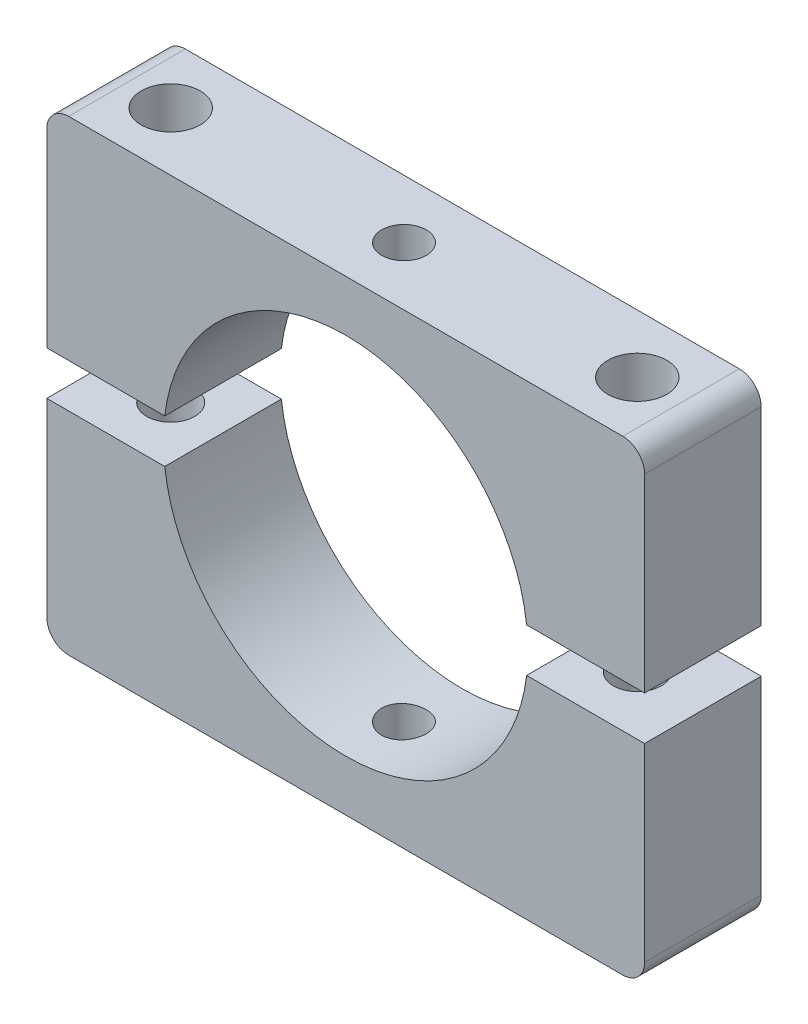
ISO-10303-21;
HEADER;
FILE_DESCRIPTION(('STEP AP214'),'2;1');
FILE_NAME('part.step','',(''),(''),'','','');
FILE_SCHEMA(('AUTOMOTIVE_DESIGN { 1 0 10303 214 1 1 1 1 }'));
ENDSEC;
DATA;
#1=APPLICATION_CONTEXT('core data for automotive mechanical design processes');
#2=APPLICATION_PROTOCOL_DEFINITION('international standard','automotive_design',2000,#1);
#3=PRODUCT_CONTEXT('',#1,'mechanical');
#4=PRODUCT('Part','Part','',(#3));
#5=PRODUCT_RELATED_PRODUCT_CATEGORY('part','',(#4));
#6=PRODUCT_DEFINITION_FORMATION('','',#4);
#7=PRODUCT_DEFINITION_CONTEXT('part definition',#1,'design');
#8=PRODUCT_DEFINITION('design','',#6,#7);
#9=PRODUCT_DEFINITION_SHAPE('','',#8);
#10=(LENGTH_UNIT() NAMED_UNIT(*) SI_UNIT(.MILLI.,.METRE.));
#11=(NAMED_UNIT(*) PLANE_ANGLE_UNIT() SI_UNIT($,.RADIAN.));
#12=(NAMED_UNIT(*) SI_UNIT($,.STERADIAN.) SOLID_ANGLE_UNIT());
#13=UNCERTAINTY_MEASURE_WITH_UNIT(LENGTH_MEASURE(1.E-05),#10,'distance_accuracy_value','');
#14=(GEOMETRIC_REPRESENTATION_CONTEXT(3) GLOBAL_UNCERTAINTY_ASSIGNED_CONTEXT((#13)) GLOBAL_UNIT_ASSIGNED_CONTEXT((#10,
#11,#12)) REPRESENTATION_CONTEXT('',''));
#15=CARTESIAN_POINT('',(0.,0.,0.));
#16=DIRECTION('',(0.,0.,1.));
#17=DIRECTION('',(1.,0.,0.));
#18=AXIS2_PLACEMENT_3D('',#15,#16,#17);
#19=CARTESIAN_POINT('',(0.,0.,4.));
#20=DIRECTION('',(0.,0.,-1.));
#21=DIRECTION('',(-1.,0.,0.));
#22=AXIS2_PLACEMENT_3D('',#19,#20,#21);
#23=PLANE('',#22);
#24=DIRECTION('',(0.,1.,0.));
#25=VECTOR('',#24,1.);
#26=CARTESIAN_POINT('',(20.5,-16.,4.));
#27=LINE('',#26,#25);
#28=CARTESIAN_POINT('',(20.5,-14.5,4.));
#29=VERTEX_POINT('',#28);
#30=CARTESIAN_POINT('',(20.5,-1.5,4.));
#31=VERTEX_POINT('',#30);
#32=EDGE_CURVE('E118',#29,#31,#27,.T.);
#33=ORIENTED_EDGE('',*,*,#32,.T.);
#34=DIRECTION('',(-1.,0.,0.));
#35=VECTOR('',#34,1.);
#36=CARTESIAN_POINT('',(0.,-1.5,4.));
#37=LINE('',#36,#35);
#38=CARTESIAN_POINT('',(12.4096736459909,-1.5,4.));
#39=VERTEX_POINT('',#38);
#40=EDGE_CURVE('E132',#31,#39,#37,.T.);
#41=ORIENTED_EDGE('',*,*,#40,.T.);
#42=CARTESIAN_POINT('',(0.,0.,4.));
#43=DIRECTION('',(0.,0.,1.));
#44=DIRECTION('',(1.,0.,0.));
#45=AXIS2_PLACEMENT_3D('',#42,#43,#44);
#46=CIRCLE('',#45,12.5);
#47=CARTESIAN_POINT('',(-12.4096736459909,-1.5,4.));
#48=VERTEX_POINT('',#47);
#49=EDGE_CURVE('E150',#48,#39,#46,.T.);
#50=ORIENTED_EDGE('',*,*,#49,.F.);
#51=CARTESIAN_POINT('',(-20.5,-1.5,4.));
#52=VERTEX_POINT('',#51);
#53=EDGE_CURVE('E87',#48,#52,#37,.T.);
#54=ORIENTED_EDGE('',*,*,#53,.T.);
#55=DIRECTION('',(0.,-1.,0.));
#56=VECTOR('',#55,1.);
#57=CARTESIAN_POINT('',(-20.5,-16.,4.));
#58=LINE('',#57,#56);
#59=CARTESIAN_POINT('',(-20.5,-14.5,4.));
#60=VERTEX_POINT('',#59);
#61=EDGE_CURVE('E156',#52,#60,#58,.T.);
#62=ORIENTED_EDGE('',*,*,#61,.T.);
#63=CARTESIAN_POINT('',(-19.,-14.5,4.));
#64=DIRECTION('',(0.,0.,-1.));
#65=DIRECTION('',(-1.,0.,0.));
#66=AXIS2_PLACEMENT_3D('',#63,#64,#65);
#67=CIRCLE('',#66,1.5);
#68=CARTESIAN_POINT('',(-19.,-16.,4.));
#69=VERTEX_POINT('',#68);
#70=EDGE_CURVE('E151',#60,#69,#67,.F.);
#71=ORIENTED_EDGE('',*,*,#70,.T.);
#72=DIRECTION('',(1.,0.,0.));
#73=VECTOR('',#72,1.);
#74=CARTESIAN_POINT('',(-20.5,-16.,4.));
#75=LINE('',#74,#73);
#76=CARTESIAN_POINT('',(19.,-16.,4.));
#77=VERTEX_POINT('',#76);
#78=EDGE_CURVE('E120',#69,#77,#75,.T.);
#79=ORIENTED_EDGE('',*,*,#78,.T.);
#80=CARTESIAN_POINT('',(19.,-14.5,4.));
#81=DIRECTION('',(0.,0.,-1.));
#82=DIRECTION('',(-1.,0.,0.));
#83=AXIS2_PLACEMENT_3D('',#80,#81,#82);
#84=CIRCLE('',#83,1.5);
#85=EDGE_CURVE('E115',#77,#29,#84,.F.);
#86=ORIENTED_EDGE('',*,*,#85,.T.);
#87=EDGE_LOOP('',(#33,#41,#50,#54,#62,#71,#79,#86));
#88=FACE_BOUND('',#87,.T.);
#89=ADVANCED_FACE('F48',(#88),#23,.F.);
#90=CARTESIAN_POINT('',(0.,0.,-4.));
#91=DIRECTION('',(0.,0.,-1.));
#92=DIRECTION('',(-1.,0.,0.));
#93=AXIS2_PLACEMENT_3D('',#90,#91,#92);
#94=PLANE('',#93);
#95=DIRECTION('',(-1.,0.,0.));
#96=VECTOR('',#95,1.);
#97=CARTESIAN_POINT('',(0.,-1.5,-4.));
#98=LINE('',#97,#96);
#99=CARTESIAN_POINT('',(20.5,-1.5,-4.));
#100=VERTEX_POINT('',#99);
#101=CARTESIAN_POINT('',(12.4096736459909,-1.5,-4.));
#102=VERTEX_POINT('',#101);
#103=EDGE_CURVE('E59',#100,#102,#98,.T.);
#104=ORIENTED_EDGE('',*,*,#103,.F.);
#105=DIRECTION('',(0.,1.,0.));
#106=VECTOR('',#105,1.);
#107=CARTESIAN_POINT('',(20.5,-16.,-4.));
#108=LINE('',#107,#106);
#109=CARTESIAN_POINT('',(20.5,-14.5,-4.));
#110=VERTEX_POINT('',#109);
#111=EDGE_CURVE('E140',#110,#100,#108,.T.);
#112=ORIENTED_EDGE('',*,*,#111,.F.);
#113=CARTESIAN_POINT('',(19.,-14.5,-4.));
#114=DIRECTION('',(0.,0.,-1.));
#115=DIRECTION('',(-1.,0.,0.));
#116=AXIS2_PLACEMENT_3D('',#113,#114,#115);
#117=CIRCLE('',#116,1.5);
#118=CARTESIAN_POINT('',(19.,-16.,-4.));
#119=VERTEX_POINT('',#118);
#120=EDGE_CURVE('E124',#110,#119,#117,.T.);
#121=ORIENTED_EDGE('',*,*,#120,.T.);
#122=DIRECTION('',(1.,0.,0.));
#123=VECTOR('',#122,1.);
#124=CARTESIAN_POINT('',(-20.5,-16.,-4.));
#125=LINE('',#124,#123);
#126=CARTESIAN_POINT('',(-19.,-16.,-4.));
#127=VERTEX_POINT('',#126);
#128=EDGE_CURVE('E146',#127,#119,#125,.T.);
#129=ORIENTED_EDGE('',*,*,#128,.F.);
#130=CARTESIAN_POINT('',(-19.,-14.5,-4.));
#131=DIRECTION('',(0.,0.,-1.));
#132=DIRECTION('',(-1.,0.,0.));
#133=AXIS2_PLACEMENT_3D('',#130,#131,#132);
#134=CIRCLE('',#133,1.5);
#135=CARTESIAN_POINT('',(-20.5,-14.5,-4.));
#136=VERTEX_POINT('',#135);
#137=EDGE_CURVE('E144',#127,#136,#134,.T.);
#138=ORIENTED_EDGE('',*,*,#137,.T.);
#139=DIRECTION('',(0.,-1.,0.));
#140=VECTOR('',#139,1.);
#141=CARTESIAN_POINT('',(-20.5,-16.,-4.));
#142=LINE('',#141,#140);
#143=CARTESIAN_POINT('',(-20.5,-1.5,-4.));
#144=VERTEX_POINT('',#143);
#145=EDGE_CURVE('E138',#144,#136,#142,.T.);
#146=ORIENTED_EDGE('',*,*,#145,.F.);
#147=CARTESIAN_POINT('',(-12.4096736459909,-1.5,-4.));
#148=VERTEX_POINT('',#147);
#149=EDGE_CURVE('E12',#148,#144,#98,.T.);
#150=ORIENTED_EDGE('',*,*,#149,.F.);
#151=CARTESIAN_POINT('',(0.,0.,-4.));
#152=DIRECTION('',(0.,0.,1.));
#153=DIRECTION('',(1.,0.,0.));
#154=AXIS2_PLACEMENT_3D('',#151,#152,#153);
#155=CIRCLE('',#154,12.5);
#156=EDGE_CURVE('E51',#148,#102,#155,.T.);
#157=ORIENTED_EDGE('',*,*,#156,.T.);
#158=EDGE_LOOP('',(#104,#112,#121,#129,#138,#146,#150,#157));
#159=FACE_BOUND('',#158,.T.);
#160=ADVANCED_FACE('F183',(#159),#94,.T.);
#161=CARTESIAN_POINT('',(20.5,-16.,4.));
#162=DIRECTION('',(-1.,0.,0.));
#163=DIRECTION('',(0.,-1.,0.));
#164=AXIS2_PLACEMENT_3D('',#161,#162,#163);
#165=PLANE('',#164);
#166=ORIENTED_EDGE('',*,*,#111,.T.);
#167=DIRECTION('',(0.,0.,1.));
#168=VECTOR('',#167,1.);
#169=CARTESIAN_POINT('',(20.5,-1.5,4.));
#170=LINE('',#169,#168);
#171=EDGE_CURVE('E84',#100,#31,#170,.T.);
#172=ORIENTED_EDGE('',*,*,#171,.T.);
#173=ORIENTED_EDGE('',*,*,#32,.F.);
#174=DIRECTION('',(0.,0.,-1.));
#175=VECTOR('',#174,1.);
#176=CARTESIAN_POINT('',(20.5,-14.5,4.));
#177=LINE('',#176,#175);
#178=EDGE_CURVE('E130',#29,#110,#177,.T.);
#179=ORIENTED_EDGE('',*,*,#178,.T.);
#180=EDGE_LOOP('',(#166,#172,#173,#179));
#181=FACE_BOUND('',#180,.T.);
#182=ADVANCED_FACE('F129',(#181),#165,.F.);
#183=CARTESIAN_POINT('',(-20.5,-16.,4.));
#184=DIRECTION('',(1.,0.,0.));
#185=DIRECTION('',(0.,0.,-1.));
#186=AXIS2_PLACEMENT_3D('',#183,#184,#185);
#187=PLANE('',#186);
#188=ORIENTED_EDGE('',*,*,#61,.F.);
#189=DIRECTION('',(0.,0.,-1.));
#190=VECTOR('',#189,1.);
#191=CARTESIAN_POINT('',(-20.5,-1.5,4.));
#192=LINE('',#191,#190);
#193=EDGE_CURVE('E66',#52,#144,#192,.T.);
#194=ORIENTED_EDGE('',*,*,#193,.T.);
#195=ORIENTED_EDGE('',*,*,#145,.T.);
#196=DIRECTION('',(0.,0.,-1.));
#197=VECTOR('',#196,1.);
#198=CARTESIAN_POINT('',(-20.5,-14.5,4.));
#199=LINE('',#198,#197);
#200=EDGE_CURVE('E159',#136,#60,#199,.F.);
#201=ORIENTED_EDGE('',*,*,#200,.T.);
#202=EDGE_LOOP('',(#188,#194,#195,#201));
#203=FACE_BOUND('',#202,.T.);
#204=ADVANCED_FACE('F248',(#203),#187,.F.);
#205=CARTESIAN_POINT('',(0.,0.,4.));
#206=DIRECTION('',(0.,0.,-1.));
#207=DIRECTION('',(-1.,0.,0.));
#208=AXIS2_PLACEMENT_3D('',#205,#206,#207);
#209=CYLINDRICAL_SURFACE('',#208,12.5);
#210=CARTESIAN_POINT('',(0.,-12.5,1.525));
#211=CARTESIAN_POINT('',(0.0853198948416378,-12.4999988332016,1.52499636523877));
#212=CARTESIAN_POINT('',(0.170693512679377,-12.4991172288424,1.51781571432522));
#213=CARTESIAN_POINT('',(0.339066246117368,-12.4956851314441,1.48928338811871));
#214=CARTESIAN_POINT('',(0.422062768492173,-12.49313288321,1.46791680861084));
#215=CARTESIAN_POINT('',(0.58321930610524,-12.4866470988356,1.41165051255262));
#216=CARTESIAN_POINT('',(0.661382493198119,-12.4827144801189,1.37675978283694));
#217=CARTESIAN_POINT('',(0.810728807188661,-12.4739056499513,1.29445498182486));
#218=CARTESIAN_POINT('',(0.881913153383581,-12.4690296037741,1.24704310350715));
#219=CARTESIAN_POINT('',(1.01567033861062,-12.4588499101414,1.14077536663807));
#220=CARTESIAN_POINT('',(1.07820123027228,-12.4535443647524,1.08186688625394));
#221=CARTESIAN_POINT('',(1.19251530896286,-12.4431189941467,0.954391053812945));
#222=CARTESIAN_POINT('',(1.24429795517592,-12.4379991782859,0.885823216020703));
#223=CARTESIAN_POINT('',(1.33580096543978,-12.4285061980782,0.740703645576914));
#224=CARTESIAN_POINT('',(1.37548218894778,-12.4241354761338,0.664127059908715));
#225=CARTESIAN_POINT('',(1.44140599645811,-12.4166604241591,0.505334761173804));
#226=CARTESIAN_POINT('',(1.46764906643114,-12.4135560483341,0.423119252152248));
#227=CARTESIAN_POINT('',(1.50582452011986,-12.4089832013221,0.25581742696445));
#228=CARTESIAN_POINT('',(1.51782759265451,-12.4075066520442,0.170747465422098));
#229=CARTESIAN_POINT('',(1.52740103458355,-12.4063318785741,-0.000211229125065101));
#230=CARTESIAN_POINT('',(1.52497195778642,-12.4066335861443,-0.0860999305858919));
#231=CARTESIAN_POINT('',(1.50580811072198,-12.4089738456448,-0.25576610546058));
#232=CARTESIAN_POINT('',(1.48915111652638,-12.4110029546355,-0.339552512440146));
#233=CARTESIAN_POINT('',(1.44212557160128,-12.4165546575979,-0.50313187548701));
#234=CARTESIAN_POINT('',(1.41175675512441,-12.420077280515,-0.582924754122869));
#235=CARTESIAN_POINT('',(1.33808573219168,-12.42822983019,-0.73649418866941));
#236=CARTESIAN_POINT('',(1.29474963467546,-12.4328626521474,-0.810254326243766));
#237=CARTESIAN_POINT('',(1.19639846075497,-12.4427113346329,-0.949484622206174));
#238=CARTESIAN_POINT('',(1.14138287538483,-12.4479272205648,-1.01495441912122));
#239=CARTESIAN_POINT('',(1.0208029364806,-12.4583963250439,-1.13619709214587));
#240=CARTESIAN_POINT('',(0.955171526751117,-12.4636495633235,-1.19190329859424));
#241=CARTESIAN_POINT('',(0.815454113813721,-12.4735693041452,-1.29151870359851));
#242=CARTESIAN_POINT('',(0.741368092651599,-12.4782358054412,-1.33542787710156));
#243=CARTESIAN_POINT('',(0.586793758984002,-12.4864589872456,-1.4102024870041));
#244=CARTESIAN_POINT('',(0.506303457935524,-12.4900153213437,-1.44106385310286));
#245=CARTESIAN_POINT('',(0.34123021275759,-12.4956142820611,-1.48881441691267));
#246=CARTESIAN_POINT('',(0.256647451269799,-12.4976569761661,-1.50570423754957));
#247=CARTESIAN_POINT('',(0.0863668551536736,-12.499989743007,-1.52494610224861));
#248=CARTESIAN_POINT('',(0.000679546644678211,-12.5002908899645,-1.52739000779428));
#249=CARTESIAN_POINT('',(-0.169883415677942,-12.4991365044925,-1.51791294112788));
#250=CARTESIAN_POINT('',(-0.254759085903897,-12.4976810076605,-1.50599226000728));
#251=CARTESIAN_POINT('',(-0.42101918714677,-12.4931837986024,-1.46820070506497));
#252=CARTESIAN_POINT('',(-0.502413696551286,-12.4901470559664,-1.44237352840944));
#253=CARTESIAN_POINT('',(-0.659716025905075,-12.4828274266629,-1.37754748258066));
#254=CARTESIAN_POINT('',(-0.735623667539808,-12.4785444995192,-1.33854818556772));
#255=CARTESIAN_POINT('',(-0.880208450125718,-12.4691825866601,-1.24826196267637));
#256=CARTESIAN_POINT('',(-0.948848157141478,-12.4640997858921,-1.19691549224077));
#257=CARTESIAN_POINT('',(-1.0765680404379,-12.4537189234349,-1.08347684826168));
#258=CARTESIAN_POINT('',(-1.13564785572844,-12.4484208536265,-1.02138426911859));
#259=CARTESIAN_POINT('',(-1.24289590788522,-12.4381725199058,-0.887811837372622));
#260=CARTESIAN_POINT('',(-1.29100332981586,-12.4332242945869,-0.816282976102471));
#261=CARTESIAN_POINT('',(-1.37452114070359,-12.4242691290256,-0.666106748996589));
#262=CARTESIAN_POINT('',(-1.40993177395118,-12.4202621706735,-0.587459520157118));
#263=CARTESIAN_POINT('',(-1.46695192954314,-12.4136569749732,-0.425476906693061));
#264=CARTESIAN_POINT('',(-1.48859598827068,-12.4110552148821,-0.342153829114185));
#265=CARTESIAN_POINT('',(-1.51757993481081,-12.4075447926587,-0.173022179205642));
#266=CARTESIAN_POINT('',(-1.52492045401336,-12.4066360557925,-0.0872137167560801));
#267=CARTESIAN_POINT('',(-1.5250777405557,-12.4066166737696,0.0838479753091421));
#268=CARTESIAN_POINT('',(-1.51799004717424,-12.4074942005111,0.169101131554043));
#269=CARTESIAN_POINT('',(-1.48969415478954,-12.4109230687954,0.337194968824707));
#270=CARTESIAN_POINT('',(-1.468485952095,-12.4134744107759,0.420035649219806));
#271=CARTESIAN_POINT('',(-1.41258049024345,-12.4199598293504,0.580941950571393));
#272=CARTESIAN_POINT('',(-1.37788760268078,-12.423893457782,0.659009109571016));
#273=CARTESIAN_POINT('',(-1.29600700161678,-12.4327009922974,0.808228991460829));
#274=CARTESIAN_POINT('',(-1.24881916096665,-12.4375749079495,0.879381643978845));
#275=CARTESIAN_POINT('',(-1.14293300648916,-12.4477525277591,1.01324136748718));
#276=CARTESIAN_POINT('',(-1.08416346573133,-12.4530587658317,1.07589190728544));
#277=CARTESIAN_POINT('',(-0.956930128289263,-12.4634806595471,1.19047896713539));
#278=CARTESIAN_POINT('',(-0.888464044881476,-12.4685962698738,1.24241295279682));
#279=CARTESIAN_POINT('',(-0.743497505156658,-12.4780808944062,1.33425187091181));
#280=CARTESIAN_POINT('',(-0.666968800934893,-12.4824471325884,1.37411247776527));
#281=CARTESIAN_POINT('',(-0.508294192840607,-12.4899127269404,1.44036028305423));
#282=CARTESIAN_POINT('',(-0.426154534728733,-12.4930134657992,1.46676219440697));
#283=CARTESIAN_POINT('',(-0.286320391114617,-12.4968470412095,1.49898850801593));
#284=CARTESIAN_POINT('',(-0.229509405562381,-12.4980236732172,1.50872889062371));
#285=CARTESIAN_POINT('',(-0.115140433345456,-12.4996005436692,1.52173584082289));
#286=CARTESIAN_POINT('',(-0.0575824518400368,-12.500000787473,1.52500245310269));
#287=CARTESIAN_POINT('',(0.,-12.5,1.525));
#288=B_SPLINE_CURVE_WITH_KNOTS('',3,(#210,#211,#212,#213,#214,#215,#216,#217,#218,#219,#220,
#221,#222,#223,#224,#225,#226,#227,#228,#229,#230,#231,#232,#233,#234,#235,#236,#237,#238,#239,
#240,#241,#242,#243,#244,#245,#246,#247,#248,#249,#250,#251,#252,#253,#254,#255,#256,#257,#258,
#259,#260,#261,#262,#263,#264,#265,#266,#267,#268,#269,#270,#271,#272,#273,#274,#275,#276,#277,
#278,#279,#280,#281,#282,#283,#284,#285,#286,#287),.UNSPECIFIED.,.T.,.F.,(4,2,2,2,2,2,2,2,2,2,2,
2,2,2,2,2,2,2,2,2,2,2,2,2,2,2,2,2,2,2,2,2,2,2,2,2,2,2,4),(0.,0.255749362188368,
0.511767849382742,0.767616502443296,1.02342037534858,1.28042379264341,1.53744013835956,
1.79527916419697,2.05310886501381,2.30965324450481,2.56618777961767,2.82132889304306,
3.07647495154312,3.33229376805136,3.58812373485874,3.84563777315018,4.10315235830852,
4.36074721670891,4.61833058954062,4.87427421406517,5.13021265210203,5.38535153068871,
5.64049869716173,5.89690190478957,6.15331479217506,6.41111607514145,6.66891239765803,
6.92605940545703,7.18319506195945,7.43863358267919,7.69407217017451,7.94942801611774,
8.204786460665,8.46176732436251,8.71880889276407,8.97678302082177,9.23447452596841,
9.40708112631514,9.5796865351552),.UNSPECIFIED.);
#289=CARTESIAN_POINT('',(0.,-12.5,1.525));
#290=VERTEX_POINT('',#289);
#291=EDGE_CURVE('E198',#290,#290,#288,.T.);
#292=ORIENTED_EDGE('',*,*,#291,.F.);
#293=EDGE_LOOP('',(#292));
#294=FACE_BOUND('',#293,.T.);
#295=DIRECTION('',(0.,0.,-1.));
#296=VECTOR('',#295,1.);
#297=CARTESIAN_POINT('',(-12.4096736459909,-1.5,4.));
#298=LINE('',#297,#296);
#299=EDGE_CURVE('E57',#48,#148,#298,.T.);
#300=ORIENTED_EDGE('',*,*,#299,.F.);
#301=ORIENTED_EDGE('',*,*,#49,.T.);
#302=DIRECTION('',(0.,0.,-1.));
#303=VECTOR('',#302,1.);
#304=CARTESIAN_POINT('',(12.4096736459909,-1.5,4.));
#305=LINE('',#304,#303);
#306=EDGE_CURVE('E154',#102,#39,#305,.F.);
#307=ORIENTED_EDGE('',*,*,#306,.F.);
#308=ORIENTED_EDGE('',*,*,#156,.F.);
#309=EDGE_LOOP('',(#300,#301,#307,#308));
#310=FACE_BOUND('',#309,.T.);
#311=ADVANCED_FACE('F184',(#294,#310),#209,.F.);
#312=CARTESIAN_POINT('',(-20.5,-16.,4.));
#313=DIRECTION('',(0.,1.,0.));
#314=DIRECTION('',(-1.,0.,0.));
#315=AXIS2_PLACEMENT_3D('',#312,#313,#314);
#316=PLANE('',#315);
#317=CARTESIAN_POINT('',(0.,-16.,0.));
#318=DIRECTION('',(0.,1.,0.));
#319=DIRECTION('',(-1.,0.,0.));
#320=AXIS2_PLACEMENT_3D('',#317,#318,#319);
#321=CIRCLE('',#320,1.525);
#322=CARTESIAN_POINT('',(-1.525,-16.,0.));
#323=VERTEX_POINT('',#322);
#324=EDGE_CURVE('E206',#323,#323,#321,.F.);
#325=ORIENTED_EDGE('',*,*,#324,.F.);
#326=EDGE_LOOP('',(#325));
#327=FACE_BOUND('',#326,.T.);
#328=CARTESIAN_POINT('',(-16.,-16.,0.));
#329=DIRECTION('',(0.,1.,0.));
#330=DIRECTION('',(0.,0.,1.));
#331=AXIS2_PLACEMENT_3D('',#328,#329,#330);
#332=CIRCLE('',#331,1.65);
#333=CARTESIAN_POINT('',(-16.,-16.,1.65));
#334=VERTEX_POINT('',#333);
#335=EDGE_CURVE('E192',#334,#334,#332,.T.);
#336=ORIENTED_EDGE('',*,*,#335,.T.);
#337=EDGE_LOOP('',(#336));
#338=FACE_BOUND('',#337,.T.);
#339=CARTESIAN_POINT('',(16.,-16.,0.));
#340=DIRECTION('',(0.,1.,0.));
#341=DIRECTION('',(0.,0.,1.));
#342=AXIS2_PLACEMENT_3D('',#339,#340,#341);
#343=CIRCLE('',#342,1.65);
#344=CARTESIAN_POINT('',(16.,-16.,1.65));
#345=VERTEX_POINT('',#344);
#346=EDGE_CURVE('E133',#345,#345,#343,.T.);
#347=ORIENTED_EDGE('',*,*,#346,.T.);
#348=EDGE_LOOP('',(#347));
#349=FACE_BOUND('',#348,.T.);
#350=ORIENTED_EDGE('',*,*,#128,.T.);
#351=DIRECTION('',(0.,0.,-1.));
#352=VECTOR('',#351,1.);
#353=CARTESIAN_POINT('',(19.,-16.,4.));
#354=LINE('',#353,#352);
#355=EDGE_CURVE('E149',#119,#77,#354,.F.);
#356=ORIENTED_EDGE('',*,*,#355,.T.);
#357=ORIENTED_EDGE('',*,*,#78,.F.);
#358=DIRECTION('',(0.,0.,-1.));
#359=VECTOR('',#358,1.);
#360=CARTESIAN_POINT('',(-19.,-16.,4.));
#361=LINE('',#360,#359);
#362=EDGE_CURVE('E155',#69,#127,#361,.T.);
#363=ORIENTED_EDGE('',*,*,#362,.T.);
#364=EDGE_LOOP('',(#350,#356,#357,#363));
#365=FACE_BOUND('',#364,.T.);
#366=ADVANCED_FACE('F231',(#327,#338,#349,#365),#316,.F.);
#367=CARTESIAN_POINT('',(19.,-14.5,4.));
#368=DIRECTION('',(0.,0.,-1.));
#369=DIRECTION('',(-1.,0.,0.));
#370=AXIS2_PLACEMENT_3D('',#367,#368,#369);
#371=CYLINDRICAL_SURFACE('',#370,1.5);
#372=ORIENTED_EDGE('',*,*,#85,.F.);
#373=ORIENTED_EDGE('',*,*,#355,.F.);
#374=ORIENTED_EDGE('',*,*,#120,.F.);
#375=ORIENTED_EDGE('',*,*,#178,.F.);
#376=EDGE_LOOP('',(#372,#373,#374,#375));
#377=FACE_BOUND('',#376,.T.);
#378=ADVANCED_FACE('F136',(#377),#371,.T.);
#379=CARTESIAN_POINT('',(-19.,-14.5,4.));
#380=DIRECTION('',(0.,0.,-1.));
#381=DIRECTION('',(-1.,0.,0.));
#382=AXIS2_PLACEMENT_3D('',#379,#380,#381);
#383=CYLINDRICAL_SURFACE('',#382,1.5);
#384=ORIENTED_EDGE('',*,*,#70,.F.);
#385=ORIENTED_EDGE('',*,*,#200,.F.);
#386=ORIENTED_EDGE('',*,*,#137,.F.);
#387=ORIENTED_EDGE('',*,*,#362,.F.);
#388=EDGE_LOOP('',(#384,#385,#386,#387));
#389=FACE_BOUND('',#388,.T.);
#390=ADVANCED_FACE('F224',(#389),#383,.T.);
#391=CARTESIAN_POINT('',(-25.5,-1.5,-20.));
#392=DIRECTION('',(0.,-1.,0.));
#393=DIRECTION('',(0.,0.,-1.));
#394=AXIS2_PLACEMENT_3D('',#391,#392,#393);
#395=PLANE('',#394);
#396=CARTESIAN_POINT('',(16.,-1.5,0.));
#397=DIRECTION('',(0.,1.,0.));
#398=DIRECTION('',(0.,0.,1.));
#399=AXIS2_PLACEMENT_3D('',#396,#397,#398);
#400=CIRCLE('',#399,1.64999999999999);
#401=CARTESIAN_POINT('',(16.,-1.5,1.64999999999999));
#402=VERTEX_POINT('',#401);
#403=EDGE_CURVE('E189',#402,#402,#400,.T.);
#404=ORIENTED_EDGE('',*,*,#403,.F.);
#405=EDGE_LOOP('',(#404));
#406=FACE_BOUND('',#405,.T.);
#407=ORIENTED_EDGE('',*,*,#103,.T.);
#408=ORIENTED_EDGE('',*,*,#306,.T.);
#409=ORIENTED_EDGE('',*,*,#40,.F.);
#410=ORIENTED_EDGE('',*,*,#171,.F.);
#411=EDGE_LOOP('',(#407,#408,#409,#410));
#412=FACE_BOUND('',#411,.T.);
#413=ADVANCED_FACE('F227',(#406,#412),#395,.F.);
#414=CARTESIAN_POINT('',(-16.,-1.5,0.));
#415=DIRECTION('',(0.,1.,0.));
#416=DIRECTION('',(0.,0.,1.));
#417=AXIS2_PLACEMENT_3D('',#414,#415,#416);
#418=CIRCLE('',#417,1.64999999999999);
#419=CARTESIAN_POINT('',(-16.,-1.5,1.64999999999999));
#420=VERTEX_POINT('',#419);
#421=EDGE_CURVE('E195',#420,#420,#418,.T.);
#422=ORIENTED_EDGE('',*,*,#421,.F.);
#423=EDGE_LOOP('',(#422));
#424=FACE_BOUND('',#423,.T.);
#425=ORIENTED_EDGE('',*,*,#53,.F.);
#426=ORIENTED_EDGE('',*,*,#299,.T.);
#427=ORIENTED_EDGE('',*,*,#149,.T.);
#428=ORIENTED_EDGE('',*,*,#193,.F.);
#429=EDGE_LOOP('',(#425,#426,#427,#428));
#430=FACE_BOUND('',#429,.T.);
#431=ADVANCED_FACE('F222',(#424,#430),#395,.F.);
#432=CARTESIAN_POINT('',(16.,-1.5,0.));
#433=DIRECTION('',(0.,1.,0.));
#434=DIRECTION('',(0.,0.,1.));
#435=AXIS2_PLACEMENT_3D('',#432,#433,#434);
#436=CYLINDRICAL_SURFACE('',#435,1.64999999999999);
#437=ORIENTED_EDGE('',*,*,#346,.F.);
#438=EDGE_LOOP('',(#437));
#439=FACE_BOUND('',#438,.T.);
#440=ORIENTED_EDGE('',*,*,#403,.T.);
#441=EDGE_LOOP('',(#440));
#442=FACE_BOUND('',#441,.T.);
#443=ADVANCED_FACE('F218',(#439,#442),#436,.F.);
#444=CARTESIAN_POINT('',(-16.,-1.5,0.));
#445=DIRECTION('',(0.,1.,0.));
#446=DIRECTION('',(0.,0.,1.));
#447=AXIS2_PLACEMENT_3D('',#444,#445,#446);
#448=CYLINDRICAL_SURFACE('',#447,1.64999999999999);
#449=ORIENTED_EDGE('',*,*,#335,.F.);
#450=EDGE_LOOP('',(#449));
#451=FACE_BOUND('',#450,.T.);
#452=ORIENTED_EDGE('',*,*,#421,.T.);
#453=EDGE_LOOP('',(#452));
#454=FACE_BOUND('',#453,.T.);
#455=ADVANCED_FACE('F214',(#451,#454),#448,.F.);
#456=CARTESIAN_POINT('',(0.,-20.3133513652379,0.));
#457=DIRECTION('',(0.,1.,0.));
#458=DIRECTION('',(0.,0.,1.));
#459=AXIS2_PLACEMENT_3D('',#456,#457,#458);
#460=CYLINDRICAL_SURFACE('',#459,1.525);
#461=ORIENTED_EDGE('',*,*,#291,.T.);
#462=EDGE_LOOP('',(#461));
#463=FACE_BOUND('',#462,.T.);
#464=ORIENTED_EDGE('',*,*,#324,.T.);
#465=EDGE_LOOP('',(#464));
#466=FACE_BOUND('',#465,.T.);
#467=ADVANCED_FACE('F210',(#463,#466),#460,.F.);
#468=CLOSED_SHELL('',(#89,#160,#182,#204,#311,#366,#378,#390,#413,#431,#443,#455,#467));
#469=MANIFOLD_SOLID_BREP('B2',#468);
#470=CARTESIAN_POINT('',(-20.5,16.,4.));
#471=DIRECTION('',(0.,-1.,0.));
#472=DIRECTION('',(1.,0.,0.));
#473=AXIS2_PLACEMENT_3D('',#470,#471,#472);
#474=PLANE('',#473);
#475=CARTESIAN_POINT('',(0.,16.,0.));
#476=DIRECTION('',(0.,1.,0.));
#477=DIRECTION('',(0.,0.,1.));
#478=AXIS2_PLACEMENT_3D('',#475,#476,#477);
#479=CIRCLE('',#478,1.525);
#480=CARTESIAN_POINT('',(0.,16.,1.525));
#481=VERTEX_POINT('',#480);
#482=EDGE_CURVE('E618',#481,#481,#479,.T.);
#483=ORIENTED_EDGE('',*,*,#482,.F.);
#484=EDGE_LOOP('',(#483));
#485=FACE_BOUND('',#484,.T.);
#486=CARTESIAN_POINT('',(16.,16.,0.));
#487=DIRECTION('',(0.,1.,0.));
#488=DIRECTION('',(-1.,0.,0.));
#489=AXIS2_PLACEMENT_3D('',#486,#487,#488);
#490=CIRCLE('',#489,2.025);
#491=CARTESIAN_POINT('',(13.975,16.,0.));
#492=VERTEX_POINT('',#491);
#493=EDGE_CURVE('E490',#492,#492,#490,.T.);
#494=ORIENTED_EDGE('',*,*,#493,.F.);
#495=EDGE_LOOP('',(#494));
#496=FACE_BOUND('',#495,.T.);
#497=CARTESIAN_POINT('',(-16.,16.,0.));
#498=DIRECTION('',(0.,1.,0.));
#499=DIRECTION('',(-1.,0.,0.));
#500=AXIS2_PLACEMENT_3D('',#497,#498,#499);
#501=CIRCLE('',#500,2.025);
#502=CARTESIAN_POINT('',(-18.025,16.,0.));
#503=VERTEX_POINT('',#502);
#504=EDGE_CURVE('E620',#503,#503,#501,.T.);
#505=ORIENTED_EDGE('',*,*,#504,.F.);
#506=EDGE_LOOP('',(#505));
#507=FACE_BOUND('',#506,.T.);
#508=DIRECTION('',(-1.,0.,0.));
#509=VECTOR('',#508,1.);
#510=CARTESIAN_POINT('',(-20.5,16.,-4.));
#511=LINE('',#510,#509);
#512=CARTESIAN_POINT('',(19.,16.,-4.));
#513=VERTEX_POINT('',#512);
#514=CARTESIAN_POINT('',(-19.,16.,-4.));
#515=VERTEX_POINT('',#514);
#516=EDGE_CURVE('E434',#513,#515,#511,.T.);
#517=ORIENTED_EDGE('',*,*,#516,.T.);
#518=DIRECTION('',(0.,0.,-1.));
#519=VECTOR('',#518,1.);
#520=CARTESIAN_POINT('',(-19.,16.,4.));
#521=LINE('',#520,#519);
#522=CARTESIAN_POINT('',(-19.,16.,4.));
#523=VERTEX_POINT('',#522);
#524=EDGE_CURVE('E419',#515,#523,#521,.F.);
#525=ORIENTED_EDGE('',*,*,#524,.T.);
#526=DIRECTION('',(-1.,0.,0.));
#527=VECTOR('',#526,1.);
#528=CARTESIAN_POINT('',(-20.5,16.,4.));
#529=LINE('',#528,#527);
#530=CARTESIAN_POINT('',(19.,16.,4.));
#531=VERTEX_POINT('',#530);
#532=EDGE_CURVE('E443',#531,#523,#529,.T.);
#533=ORIENTED_EDGE('',*,*,#532,.F.);
#534=DIRECTION('',(0.,0.,-1.));
#535=VECTOR('',#534,1.);
#536=CARTESIAN_POINT('',(19.,16.,4.));
#537=LINE('',#536,#535);
#538=EDGE_CURVE('E467',#531,#513,#537,.T.);
#539=ORIENTED_EDGE('',*,*,#538,.T.);
#540=EDGE_LOOP('',(#517,#525,#533,#539));
#541=FACE_BOUND('',#540,.T.);
#542=ADVANCED_FACE('F344',(#485,#496,#507,#541),#474,.F.);
#543=CARTESIAN_POINT('',(19.,14.5,4.));
#544=DIRECTION('',(0.,0.,-1.));
#545=DIRECTION('',(-1.,0.,0.));
#546=AXIS2_PLACEMENT_3D('',#543,#544,#545);
#547=CYLINDRICAL_SURFACE('',#546,1.5);
#548=CARTESIAN_POINT('',(19.,14.5,4.));
#549=DIRECTION('',(0.,0.,-1.));
#550=DIRECTION('',(-1.,0.,0.));
#551=AXIS2_PLACEMENT_3D('',#548,#549,#550);
#552=CIRCLE('',#551,1.5);
#553=CARTESIAN_POINT('',(20.5,14.5,4.));
#554=VERTEX_POINT('',#553);
#555=EDGE_CURVE('E460',#554,#531,#552,.F.);
#556=ORIENTED_EDGE('',*,*,#555,.F.);
#557=DIRECTION('',(0.,0.,-1.));
#558=VECTOR('',#557,1.);
#559=CARTESIAN_POINT('',(20.5,14.5,4.));
#560=LINE('',#559,#558);
#561=CARTESIAN_POINT('',(20.5,14.5,-4.));
#562=VERTEX_POINT('',#561);
#563=EDGE_CURVE('E447',#562,#554,#560,.F.);
#564=ORIENTED_EDGE('',*,*,#563,.F.);
#565=CARTESIAN_POINT('',(19.,14.5,-4.));
#566=DIRECTION('',(0.,0.,-1.));
#567=DIRECTION('',(-1.,0.,0.));
#568=AXIS2_PLACEMENT_3D('',#565,#566,#567);
#569=CIRCLE('',#568,1.5);
#570=EDGE_CURVE('E455',#513,#562,#569,.T.);
#571=ORIENTED_EDGE('',*,*,#570,.F.);
#572=ORIENTED_EDGE('',*,*,#538,.F.);
#573=EDGE_LOOP('',(#556,#564,#571,#572));
#574=FACE_BOUND('',#573,.T.);
#575=ADVANCED_FACE('F346',(#574),#547,.T.);
#576=CARTESIAN_POINT('',(-19.,14.5,4.));
#577=DIRECTION('',(0.,0.,-1.));
#578=DIRECTION('',(-1.,0.,0.));
#579=AXIS2_PLACEMENT_3D('',#576,#577,#578);
#580=CYLINDRICAL_SURFACE('',#579,1.5);
#581=CARTESIAN_POINT('',(-19.,14.5,4.));
#582=DIRECTION('',(0.,0.,-1.));
#583=DIRECTION('',(-1.,0.,0.));
#584=AXIS2_PLACEMENT_3D('',#581,#582,#583);
#585=CIRCLE('',#584,1.5);
#586=CARTESIAN_POINT('',(-20.5,14.5,4.));
#587=VERTEX_POINT('',#586);
#588=EDGE_CURVE('E462',#523,#587,#585,.F.);
#589=ORIENTED_EDGE('',*,*,#588,.F.);
#590=ORIENTED_EDGE('',*,*,#524,.F.);
#591=CARTESIAN_POINT('',(-19.,14.5,-4.));
#592=DIRECTION('',(0.,0.,-1.));
#593=DIRECTION('',(-1.,0.,0.));
#594=AXIS2_PLACEMENT_3D('',#591,#592,#593);
#595=CIRCLE('',#594,1.5);
#596=CARTESIAN_POINT('',(-20.5,14.5,-4.));
#597=VERTEX_POINT('',#596);
#598=EDGE_CURVE('E458',#597,#515,#595,.T.);
#599=ORIENTED_EDGE('',*,*,#598,.F.);
#600=DIRECTION('',(0.,0.,-1.));
#601=VECTOR('',#600,1.);
#602=CARTESIAN_POINT('',(-20.5,14.5,4.));
#603=LINE('',#602,#601);
#604=EDGE_CURVE('E464',#587,#597,#603,.T.);
#605=ORIENTED_EDGE('',*,*,#604,.F.);
#606=EDGE_LOOP('',(#589,#590,#599,#605));
#607=FACE_BOUND('',#606,.T.);
#608=ADVANCED_FACE('F479',(#607),#580,.T.);
#609=CARTESIAN_POINT('',(0.,0.,4.));
#610=DIRECTION('',(0.,0.,-1.));
#611=DIRECTION('',(-1.,0.,0.));
#612=AXIS2_PLACEMENT_3D('',#609,#610,#611);
#613=CYLINDRICAL_SURFACE('',#612,12.5);
#614=CARTESIAN_POINT('',(0.,12.5,1.525));
#615=CARTESIAN_POINT('',(-0.0853198948416405,12.4999988332016,1.52499636523877));
#616=CARTESIAN_POINT('',(-0.17069351267938,12.4991172288424,1.51781571432522));
#617=CARTESIAN_POINT('',(-0.33906624611737,12.4956851314441,1.48928338811871));
#618=CARTESIAN_POINT('',(-0.422062768492175,12.49313288321,1.46791680861084));
#619=CARTESIAN_POINT('',(-0.583219306105242,12.4866470988356,1.41165051255262));
#620=CARTESIAN_POINT('',(-0.661382493198121,12.4827144801189,1.37675978283694));
#621=CARTESIAN_POINT('',(-0.810728807188664,12.4739056499513,1.29445498182486));
#622=CARTESIAN_POINT('',(-0.881913153383584,12.4690296037741,1.24704310350715));
#623=CARTESIAN_POINT('',(-1.01567033861062,12.4588499101414,1.14077536663807));
#624=CARTESIAN_POINT('',(-1.07820123027229,12.4535443647524,1.08186688625394));
#625=CARTESIAN_POINT('',(-1.19251530896286,12.4431189941467,0.954391053812945));
#626=CARTESIAN_POINT('',(-1.24429795517592,12.4379991782859,0.885823216020703));
#627=CARTESIAN_POINT('',(-1.33580096543979,12.4285061980782,0.740703645576914));
#628=CARTESIAN_POINT('',(-1.37548218894778,12.4241354761338,0.664127059908715));
#629=CARTESIAN_POINT('',(-1.44140599645812,12.4166604241591,0.505334761173804));
#630=CARTESIAN_POINT('',(-1.46764906643114,12.4135560483341,0.423119252152248));
#631=CARTESIAN_POINT('',(-1.50582452011987,12.4089832013221,0.25581742696445));
#632=CARTESIAN_POINT('',(-1.51782759265451,12.4075066520442,0.170747465422098));
#633=CARTESIAN_POINT('',(-1.52740103458355,12.4063318785741,-0.000211229125064613));
#634=CARTESIAN_POINT('',(-1.52497195778643,12.4066335861443,-0.0860999305858914));
#635=CARTESIAN_POINT('',(-1.50580811072198,12.4089738456448,-0.255766105460579));
#636=CARTESIAN_POINT('',(-1.48915111652639,12.4110029546355,-0.339552512440145));
#637=CARTESIAN_POINT('',(-1.44212557160128,12.4165546575979,-0.503131875487009));
#638=CARTESIAN_POINT('',(-1.41175675512442,12.420077280515,-0.582924754122868));
#639=CARTESIAN_POINT('',(-1.33808573219169,12.42822983019,-0.736494188669409));
#640=CARTESIAN_POINT('',(-1.29474963467546,12.4328626521474,-0.810254326243766));
#641=CARTESIAN_POINT('',(-1.19639846075497,12.4427113346329,-0.949484622206174));
#642=CARTESIAN_POINT('',(-1.14138287538483,12.4479272205648,-1.01495441912122));
#643=CARTESIAN_POINT('',(-1.0208029364806,12.4583963250439,-1.13619709214587));
#644=CARTESIAN_POINT('',(-0.95517152675112,12.4636495633235,-1.19190329859424));
#645=CARTESIAN_POINT('',(-0.815454113813725,12.4735693041452,-1.29151870359851));
#646=CARTESIAN_POINT('',(-0.741368092651603,12.4782358054412,-1.33542787710156));
#647=CARTESIAN_POINT('',(-0.586793758984005,12.4864589872456,-1.4102024870041));
#648=CARTESIAN_POINT('',(-0.506303457935527,12.4900153213437,-1.44106385310286));
#649=CARTESIAN_POINT('',(-0.341230212757594,12.4956142820611,-1.48881441691267));
#650=CARTESIAN_POINT('',(-0.256647451269803,12.4976569761661,-1.50570423754957));
#651=CARTESIAN_POINT('',(-0.0863668551536774,12.499989743007,-1.52494610224861));
#652=CARTESIAN_POINT('',(-0.000679546644682046,12.5002908899645,-1.52739000779428));
#653=CARTESIAN_POINT('',(0.169883415677938,12.4991365044925,-1.51791294112788));
#654=CARTESIAN_POINT('',(0.254759085903893,12.4976810076605,-1.50599226000728));
#655=CARTESIAN_POINT('',(0.421019187146766,12.4931837986024,-1.46820070506497));
#656=CARTESIAN_POINT('',(0.502413696551282,12.4901470559664,-1.44237352840944));
#657=CARTESIAN_POINT('',(0.659716025905072,12.4828274266629,-1.37754748258066));
#658=CARTESIAN_POINT('',(0.735623667539805,12.4785444995192,-1.33854818556772));
#659=CARTESIAN_POINT('',(0.880208450125715,12.4691825866601,-1.24826196267637));
#660=CARTESIAN_POINT('',(0.948848157141475,12.4640997858921,-1.19691549224077));
#661=CARTESIAN_POINT('',(1.07656804043789,12.4537189234349,-1.08347684826168));
#662=CARTESIAN_POINT('',(1.13564785572844,12.4484208536265,-1.02138426911859));
#663=CARTESIAN_POINT('',(1.24289590788522,12.4381725199058,-0.887811837372622));
#664=CARTESIAN_POINT('',(1.29100332981585,12.4332242945869,-0.816282976102472));
#665=CARTESIAN_POINT('',(1.37452114070359,12.4242691290256,-0.666106748996591));
#666=CARTESIAN_POINT('',(1.40993177395118,12.4202621706735,-0.58745952015712));
#667=CARTESIAN_POINT('',(1.46695192954314,12.4136569749732,-0.425476906693063));
#668=CARTESIAN_POINT('',(1.48859598827068,12.4110552148821,-0.342153829114187));
#669=CARTESIAN_POINT('',(1.5175799348108,12.4075447926587,-0.173022179205644));
#670=CARTESIAN_POINT('',(1.52492045401336,12.4066360557925,-0.087213716756082));
#671=CARTESIAN_POINT('',(1.5250777405557,12.4066166737696,0.0838479753091407));
#672=CARTESIAN_POINT('',(1.51799004717423,12.4074942005111,0.169101131554042));
#673=CARTESIAN_POINT('',(1.48969415478954,12.4109230687954,0.337194968824706));
#674=CARTESIAN_POINT('',(1.468485952095,12.4134744107759,0.420035649219805));
#675=CARTESIAN_POINT('',(1.41258049024345,12.4199598293504,0.580941950571392));
#676=CARTESIAN_POINT('',(1.37788760268078,12.423893457782,0.659009109571016));
#677=CARTESIAN_POINT('',(1.29600700161677,12.4327009922974,0.808228991460829));
#678=CARTESIAN_POINT('',(1.24881916096664,12.4375749079495,0.879381643978845));
#679=CARTESIAN_POINT('',(1.14293300648916,12.4477525277591,1.01324136748718));
#680=CARTESIAN_POINT('',(1.08416346573133,12.4530587658317,1.07589190728544));
#681=CARTESIAN_POINT('',(0.956930128289261,12.4634806595471,1.19047896713539));
#682=CARTESIAN_POINT('',(0.888464044881474,12.4685962698738,1.24241295279682));
#683=CARTESIAN_POINT('',(0.743497505156656,12.4780808944062,1.33425187091181));
#684=CARTESIAN_POINT('',(0.666968800934891,12.4824471325884,1.37411247776527));
#685=CARTESIAN_POINT('',(0.508294192840605,12.4899127269404,1.44036028305423));
#686=CARTESIAN_POINT('',(0.426154534728731,12.4930134657992,1.46676219440697));
#687=CARTESIAN_POINT('',(0.286320391114616,12.4968470412095,1.49898850801593));
#688=CARTESIAN_POINT('',(0.22950940556238,12.4980236732172,1.50872889062371));
#689=CARTESIAN_POINT('',(0.115140433345454,12.4996005436692,1.52173584082289));
#690=CARTESIAN_POINT('',(0.0575824518400346,12.500000787473,1.52500245310269));
#691=CARTESIAN_POINT('',(0.,12.5,1.525));
#692=B_SPLINE_CURVE_WITH_KNOTS('',3,(#614,#615,#616,#617,#618,#619,#620,#621,#622,#623,#624,
#625,#626,#627,#628,#629,#630,#631,#632,#633,#634,#635,#636,#637,#638,#639,#640,#641,#642,#643,
#644,#645,#646,#647,#648,#649,#650,#651,#652,#653,#654,#655,#656,#657,#658,#659,#660,#661,#662,
#663,#664,#665,#666,#667,#668,#669,#670,#671,#672,#673,#674,#675,#676,#677,#678,#679,#680,#681,
#682,#683,#684,#685,#686,#687,#688,#689,#690,#691),.UNSPECIFIED.,.T.,.F.,(4,2,2,2,2,2,2,2,2,2,2,
2,2,2,2,2,2,2,2,2,2,2,2,2,2,2,2,2,2,2,2,2,2,2,2,2,2,2,4),(0.,0.255749362188368,
0.511767849382742,0.767616502443296,1.02342037534858,1.28042379264341,1.53744013835956,
1.79527916419697,2.05310886501381,2.30965324450481,2.56618777961767,2.82132889304306,
3.07647495154312,3.33229376805136,3.58812373485874,3.84563777315018,4.10315235830852,
4.36074721670891,4.61833058954062,4.87427421406517,5.13021265210203,5.38535153068871,
5.64049869716173,5.89690190478957,6.15331479217506,6.41111607514144,6.66891239765803,
6.92605940545703,7.18319506195945,7.43863358267919,7.69407217017451,7.94942801611774,
8.204786460665,8.46176732436251,8.71880889276407,8.97678302082177,9.23447452596841,
9.40708112631514,9.5796865351552),.UNSPECIFIED.);
#693=CARTESIAN_POINT('',(0.,12.5,1.525));
#694=VERTEX_POINT('',#693);
#695=EDGE_CURVE('E348',#694,#694,#692,.T.);
#696=ORIENTED_EDGE('',*,*,#695,.F.);
#697=EDGE_LOOP('',(#696));
#698=FACE_BOUND('',#697,.T.);
#699=DIRECTION('',(0.,0.,-1.));
#700=VECTOR('',#699,1.);
#701=CARTESIAN_POINT('',(12.4096736459909,1.5,4.));
#702=LINE('',#701,#700);
#703=CARTESIAN_POINT('',(12.4096736459909,1.5,4.));
#704=VERTEX_POINT('',#703);
#705=CARTESIAN_POINT('',(12.4096736459909,1.5,-4.));
#706=VERTEX_POINT('',#705);
#707=EDGE_CURVE('E46',#704,#706,#702,.T.);
#708=ORIENTED_EDGE('',*,*,#707,.F.);
#709=CARTESIAN_POINT('',(0.,0.,4.));
#710=DIRECTION('',(0.,0.,1.));
#711=DIRECTION('',(1.,0.,0.));
#712=AXIS2_PLACEMENT_3D('',#709,#710,#711);
#713=CIRCLE('',#712,12.5);
#714=CARTESIAN_POINT('',(-12.4096736459909,1.5,4.));
#715=VERTEX_POINT('',#714);
#716=EDGE_CURVE('E425',#704,#715,#713,.T.);
#717=ORIENTED_EDGE('',*,*,#716,.T.);
#718=DIRECTION('',(0.,0.,-1.));
#719=VECTOR('',#718,1.);
#720=CARTESIAN_POINT('',(-12.4096736459909,1.5,4.));
#721=LINE('',#720,#719);
#722=CARTESIAN_POINT('',(-12.4096736459909,1.5,-4.));
#723=VERTEX_POINT('',#722);
#724=EDGE_CURVE('E358',#723,#715,#721,.F.);
#725=ORIENTED_EDGE('',*,*,#724,.F.);
#726=CARTESIAN_POINT('',(0.,0.,-4.));
#727=DIRECTION('',(0.,0.,1.));
#728=DIRECTION('',(1.,0.,0.));
#729=AXIS2_PLACEMENT_3D('',#726,#727,#728);
#730=CIRCLE('',#729,12.5);
#731=EDGE_CURVE('E432',#706,#723,#730,.T.);
#732=ORIENTED_EDGE('',*,*,#731,.F.);
#733=EDGE_LOOP('',(#708,#717,#725,#732));
#734=FACE_BOUND('',#733,.T.);
#735=ADVANCED_FACE('F430',(#698,#734),#613,.F.);
#736=CARTESIAN_POINT('',(20.5,-16.,4.));
#737=DIRECTION('',(-1.,0.,0.));
#738=DIRECTION('',(0.,-1.,0.));
#739=AXIS2_PLACEMENT_3D('',#736,#737,#738);
#740=PLANE('',#739);
#741=DIRECTION('',(0.,1.,0.));
#742=VECTOR('',#741,1.);
#743=CARTESIAN_POINT('',(20.5,-16.,4.));
#744=LINE('',#743,#742);
#745=CARTESIAN_POINT('',(20.5,1.5,4.));
#746=VERTEX_POINT('',#745);
#747=EDGE_CURVE('E441',#746,#554,#744,.T.);
#748=ORIENTED_EDGE('',*,*,#747,.F.);
#749=DIRECTION('',(0.,0.,-1.));
#750=VECTOR('',#749,1.);
#751=CARTESIAN_POINT('',(20.5,1.5,4.));
#752=LINE('',#751,#750);
#753=CARTESIAN_POINT('',(20.5,1.5,-4.));
#754=VERTEX_POINT('',#753);
#755=EDGE_CURVE('E436',#746,#754,#752,.T.);
#756=ORIENTED_EDGE('',*,*,#755,.T.);
#757=DIRECTION('',(0.,1.,0.));
#758=VECTOR('',#757,1.);
#759=CARTESIAN_POINT('',(20.5,-16.,-4.));
#760=LINE('',#759,#758);
#761=EDGE_CURVE('E431',#754,#562,#760,.T.);
#762=ORIENTED_EDGE('',*,*,#761,.T.);
#763=ORIENTED_EDGE('',*,*,#563,.T.);
#764=EDGE_LOOP('',(#748,#756,#762,#763));
#765=FACE_BOUND('',#764,.T.);
#766=ADVANCED_FACE('F497',(#765),#740,.F.);
#767=CARTESIAN_POINT('',(-20.5,-16.,4.));
#768=DIRECTION('',(1.,0.,0.));
#769=DIRECTION('',(0.,0.,-1.));
#770=AXIS2_PLACEMENT_3D('',#767,#768,#769);
#771=PLANE('',#770);
#772=DIRECTION('',(0.,-1.,0.));
#773=VECTOR('',#772,1.);
#774=CARTESIAN_POINT('',(-20.5,-16.,-4.));
#775=LINE('',#774,#773);
#776=CARTESIAN_POINT('',(-20.5,1.5,-4.));
#777=VERTEX_POINT('',#776);
#778=EDGE_CURVE('E444',#597,#777,#775,.T.);
#779=ORIENTED_EDGE('',*,*,#778,.T.);
#780=DIRECTION('',(0.,0.,1.));
#781=VECTOR('',#780,1.);
#782=CARTESIAN_POINT('',(-20.5,1.5,4.));
#783=LINE('',#782,#781);
#784=CARTESIAN_POINT('',(-20.5,1.5,4.));
#785=VERTEX_POINT('',#784);
#786=EDGE_CURVE('E428',#777,#785,#783,.T.);
#787=ORIENTED_EDGE('',*,*,#786,.T.);
#788=DIRECTION('',(0.,-1.,0.));
#789=VECTOR('',#788,1.);
#790=CARTESIAN_POINT('',(-20.5,-16.,4.));
#791=LINE('',#790,#789);
#792=EDGE_CURVE('E427',#587,#785,#791,.T.);
#793=ORIENTED_EDGE('',*,*,#792,.F.);
#794=ORIENTED_EDGE('',*,*,#604,.T.);
#795=EDGE_LOOP('',(#779,#787,#793,#794));
#796=FACE_BOUND('',#795,.T.);
#797=ADVANCED_FACE('F482',(#796),#771,.F.);
#798=CARTESIAN_POINT('',(0.,0.,-4.));
#799=DIRECTION('',(0.,0.,-1.));
#800=DIRECTION('',(-1.,0.,0.));
#801=AXIS2_PLACEMENT_3D('',#798,#799,#800);
#802=PLANE('',#801);
#803=DIRECTION('',(1.,0.,0.));
#804=VECTOR('',#803,1.);
#805=CARTESIAN_POINT('',(0.,1.5,-4.));
#806=LINE('',#805,#804);
#807=EDGE_CURVE('E365',#777,#723,#806,.T.);
#808=ORIENTED_EDGE('',*,*,#807,.F.);
#809=ORIENTED_EDGE('',*,*,#778,.F.);
#810=ORIENTED_EDGE('',*,*,#598,.T.);
#811=ORIENTED_EDGE('',*,*,#516,.F.);
#812=ORIENTED_EDGE('',*,*,#570,.T.);
#813=ORIENTED_EDGE('',*,*,#761,.F.);
#814=EDGE_CURVE('E488',#706,#754,#806,.T.);
#815=ORIENTED_EDGE('',*,*,#814,.F.);
#816=ORIENTED_EDGE('',*,*,#731,.T.);
#817=EDGE_LOOP('',(#808,#809,#810,#811,#812,#813,#815,#816));
#818=FACE_BOUND('',#817,.T.);
#819=ADVANCED_FACE('F484',(#818),#802,.T.);
#820=CARTESIAN_POINT('',(0.,0.,4.));
#821=DIRECTION('',(0.,0.,-1.));
#822=DIRECTION('',(-1.,0.,0.));
#823=AXIS2_PLACEMENT_3D('',#820,#821,#822);
#824=PLANE('',#823);
#825=ORIENTED_EDGE('',*,*,#792,.T.);
#826=DIRECTION('',(1.,0.,0.));
#827=VECTOR('',#826,1.);
#828=CARTESIAN_POINT('',(0.,1.5,4.));
#829=LINE('',#828,#827);
#830=EDGE_CURVE('E413',#785,#715,#829,.T.);
#831=ORIENTED_EDGE('',*,*,#830,.T.);
#832=ORIENTED_EDGE('',*,*,#716,.F.);
#833=EDGE_CURVE('E372',#704,#746,#829,.T.);
#834=ORIENTED_EDGE('',*,*,#833,.T.);
#835=ORIENTED_EDGE('',*,*,#747,.T.);
#836=ORIENTED_EDGE('',*,*,#555,.T.);
#837=ORIENTED_EDGE('',*,*,#532,.T.);
#838=ORIENTED_EDGE('',*,*,#588,.T.);
#839=EDGE_LOOP('',(#825,#831,#832,#834,#835,#836,#837,#838));
#840=FACE_BOUND('',#839,.T.);
#841=ADVANCED_FACE('F424',(#840),#824,.F.);
#842=CARTESIAN_POINT('',(-25.5,1.5,-20.));
#843=DIRECTION('',(0.,1.,0.));
#844=DIRECTION('',(0.,0.,1.));
#845=AXIS2_PLACEMENT_3D('',#842,#843,#844);
#846=PLANE('',#845);
#847=CARTESIAN_POINT('',(-16.,1.5,0.));
#848=DIRECTION('',(0.,1.,0.));
#849=DIRECTION('',(0.,0.,1.));
#850=AXIS2_PLACEMENT_3D('',#847,#848,#849);
#851=CIRCLE('',#850,2.025);
#852=CARTESIAN_POINT('',(-16.,1.5,2.025));
#853=VERTEX_POINT('',#852);
#854=EDGE_CURVE('E623',#853,#853,#851,.F.);
#855=ORIENTED_EDGE('',*,*,#854,.F.);
#856=EDGE_LOOP('',(#855));
#857=FACE_BOUND('',#856,.T.);
#858=ORIENTED_EDGE('',*,*,#807,.T.);
#859=ORIENTED_EDGE('',*,*,#724,.T.);
#860=ORIENTED_EDGE('',*,*,#830,.F.);
#861=ORIENTED_EDGE('',*,*,#786,.F.);
#862=EDGE_LOOP('',(#858,#859,#860,#861));
#863=FACE_BOUND('',#862,.T.);
#864=ADVANCED_FACE('F412',(#857,#863),#846,.F.);
#865=CARTESIAN_POINT('',(16.,1.5,0.));
#866=DIRECTION('',(0.,1.,0.));
#867=DIRECTION('',(0.,0.,1.));
#868=AXIS2_PLACEMENT_3D('',#865,#866,#867);
#869=CIRCLE('',#868,2.025);
#870=CARTESIAN_POINT('',(16.,1.5,2.025));
#871=VERTEX_POINT('',#870);
#872=EDGE_CURVE('E486',#871,#871,#869,.F.);
#873=ORIENTED_EDGE('',*,*,#872,.F.);
#874=EDGE_LOOP('',(#873));
#875=FACE_BOUND('',#874,.T.);
#876=ORIENTED_EDGE('',*,*,#833,.F.);
#877=ORIENTED_EDGE('',*,*,#707,.T.);
#878=ORIENTED_EDGE('',*,*,#814,.T.);
#879=ORIENTED_EDGE('',*,*,#755,.F.);
#880=EDGE_LOOP('',(#876,#877,#878,#879));
#881=FACE_BOUND('',#880,.T.);
#882=ADVANCED_FACE('F526',(#875,#881),#846,.F.);
#883=CARTESIAN_POINT('',(16.,-4.22756492761103,0.));
#884=DIRECTION('',(0.,1.,0.));
#885=DIRECTION('',(-1.,0.,0.));
#886=AXIS2_PLACEMENT_3D('',#883,#884,#885);
#887=CYLINDRICAL_SURFACE('',#886,2.025);
#888=ORIENTED_EDGE('',*,*,#872,.T.);
#889=EDGE_LOOP('',(#888));
#890=FACE_BOUND('',#889,.T.);
#891=ORIENTED_EDGE('',*,*,#493,.T.);
#892=EDGE_LOOP('',(#891));
#893=FACE_BOUND('',#892,.T.);
#894=ADVANCED_FACE('F550',(#890,#893),#887,.F.);
#895=CARTESIAN_POINT('',(-16.,-4.22756492761103,0.));
#896=DIRECTION('',(0.,1.,0.));
#897=DIRECTION('',(-1.,0.,0.));
#898=AXIS2_PLACEMENT_3D('',#895,#896,#897);
#899=CYLINDRICAL_SURFACE('',#898,2.025);
#900=ORIENTED_EDGE('',*,*,#854,.T.);
#901=EDGE_LOOP('',(#900));
#902=FACE_BOUND('',#901,.T.);
#903=ORIENTED_EDGE('',*,*,#504,.T.);
#904=EDGE_LOOP('',(#903));
#905=FACE_BOUND('',#904,.T.);
#906=ADVANCED_FACE('F557',(#902,#905),#899,.F.);
#907=CARTESIAN_POINT('',(0.,-20.3133513652379,0.));
#908=DIRECTION('',(0.,1.,0.));
#909=DIRECTION('',(0.,0.,1.));
#910=AXIS2_PLACEMENT_3D('',#907,#908,#909);
#911=CYLINDRICAL_SURFACE('',#910,1.525);
#912=ORIENTED_EDGE('',*,*,#695,.T.);
#913=EDGE_LOOP('',(#912));
#914=FACE_BOUND('',#913,.T.);
#915=ORIENTED_EDGE('',*,*,#482,.T.);
#916=EDGE_LOOP('',(#915));
#917=FACE_BOUND('',#916,.T.);
#918=ADVANCED_FACE('F565',(#914,#917),#911,.F.);
#919=CLOSED_SHELL('',(#542,#575,#608,#735,#766,#797,#819,#841,#864,#882,#894,#906,#918));
#920=MANIFOLD_SOLID_BREP('B6',#919);
#921=ADVANCED_BREP_SHAPE_REPRESENTATION('',(#18,#469,#920),#14);
#922=SHAPE_DEFINITION_REPRESENTATION(#9,#921);
ENDSEC;
END-ISO-10303-21;
